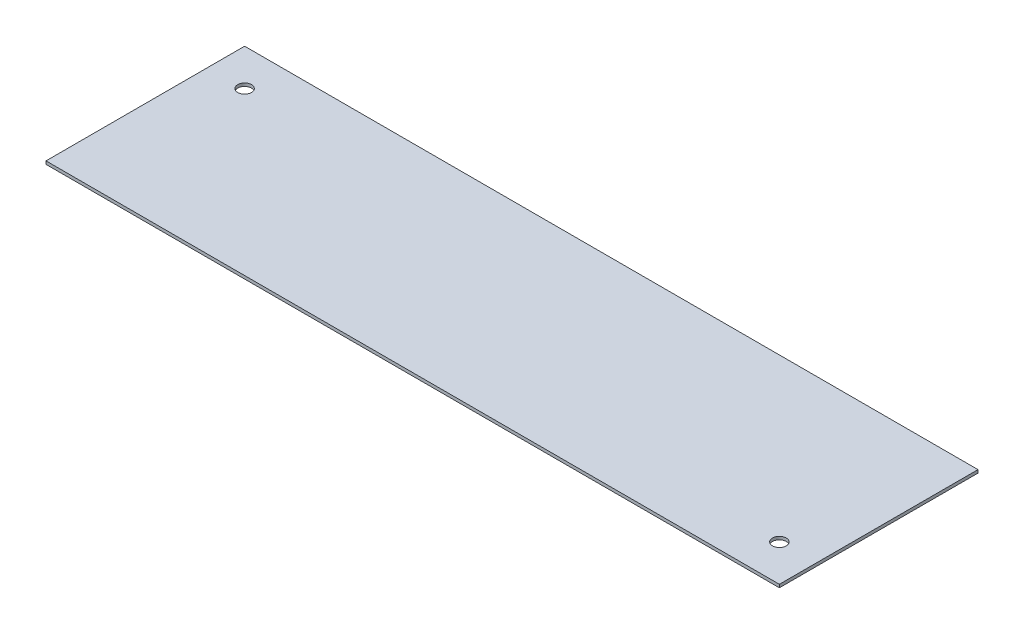
ISO-10303-21;
HEADER;
FILE_DESCRIPTION(('STEP AP214'),'2;1');
FILE_NAME('part.step','',(''),(''),'','','');
FILE_SCHEMA(('AUTOMOTIVE_DESIGN { 1 0 10303 214 1 1 1 1 }'));
ENDSEC;
DATA;
#1=APPLICATION_CONTEXT('core data for automotive mechanical design processes');
#2=APPLICATION_PROTOCOL_DEFINITION('international standard','automotive_design',2000,#1);
#3=PRODUCT_CONTEXT('',#1,'mechanical');
#4=PRODUCT('Part','Part','',(#3));
#5=PRODUCT_RELATED_PRODUCT_CATEGORY('part','',(#4));
#6=PRODUCT_DEFINITION_FORMATION('','',#4);
#7=PRODUCT_DEFINITION_CONTEXT('part definition',#1,'design');
#8=PRODUCT_DEFINITION('design','',#6,#7);
#9=PRODUCT_DEFINITION_SHAPE('','',#8);
#10=(LENGTH_UNIT() NAMED_UNIT(*) SI_UNIT(.MILLI.,.METRE.));
#11=(NAMED_UNIT(*) PLANE_ANGLE_UNIT() SI_UNIT($,.RADIAN.));
#12=(NAMED_UNIT(*) SI_UNIT($,.STERADIAN.) SOLID_ANGLE_UNIT());
#13=UNCERTAINTY_MEASURE_WITH_UNIT(LENGTH_MEASURE(1.E-05),#10,'distance_accuracy_value','');
#14=(GEOMETRIC_REPRESENTATION_CONTEXT(3) GLOBAL_UNCERTAINTY_ASSIGNED_CONTEXT((#13)) GLOBAL_UNIT_ASSIGNED_CONTEXT((#10,
#11,#12)) REPRESENTATION_CONTEXT('',''));
#15=CARTESIAN_POINT('',(0.,0.,0.));
#16=DIRECTION('',(0.,0.,1.));
#17=DIRECTION('',(1.,0.,0.));
#18=AXIS2_PLACEMENT_3D('',#15,#16,#17);
#19=CARTESIAN_POINT('',(-127.622516556291,1.,-32.2086092715232));
#20=DIRECTION('',(1.,0.,0.));
#21=DIRECTION('',(0.,0.,-1.));
#22=AXIS2_PLACEMENT_3D('',#19,#20,#21);
#23=PLANE('',#22);
#24=DIRECTION('',(0.,0.,1.));
#25=VECTOR('',#24,1.);
#26=CARTESIAN_POINT('',(-127.622516556291,0.,-32.2086092715232));
#27=LINE('',#26,#25);
#28=CARTESIAN_POINT('',(-127.622516556291,0.,-32.2086092715232));
#29=VERTEX_POINT('',#28);
#30=CARTESIAN_POINT('',(-127.622516556291,0.,32.7913907284768));
#31=VERTEX_POINT('',#30);
#32=EDGE_CURVE('E95',#29,#31,#27,.T.);
#33=ORIENTED_EDGE('',*,*,#32,.T.);
#34=DIRECTION('',(0.,-1.,0.));
#35=VECTOR('',#34,1.);
#36=CARTESIAN_POINT('',(-127.622516556291,1.,32.7913907284768));
#37=LINE('',#36,#35);
#38=CARTESIAN_POINT('',(-127.622516556291,1.,32.7913907284768));
#39=VERTEX_POINT('',#38);
#40=EDGE_CURVE('E11',#39,#31,#37,.T.);
#41=ORIENTED_EDGE('',*,*,#40,.F.);
#42=DIRECTION('',(0.,0.,1.));
#43=VECTOR('',#42,1.);
#44=CARTESIAN_POINT('',(-127.622516556291,1.,-32.2086092715232));
#45=LINE('',#44,#43);
#46=CARTESIAN_POINT('',(-127.622516556291,1.,-32.2086092715232));
#47=VERTEX_POINT('',#46);
#48=EDGE_CURVE('E83',#47,#39,#45,.T.);
#49=ORIENTED_EDGE('',*,*,#48,.F.);
#50=DIRECTION('',(0.,-1.,0.));
#51=VECTOR('',#50,1.);
#52=CARTESIAN_POINT('',(-127.622516556291,1.,-32.2086092715232));
#53=LINE('',#52,#51);
#54=EDGE_CURVE('E91',#47,#29,#53,.T.);
#55=ORIENTED_EDGE('',*,*,#54,.T.);
#56=EDGE_LOOP('',(#33,#41,#49,#55));
#57=FACE_BOUND('',#56,.T.);
#58=ADVANCED_FACE('F32',(#57),#23,.F.);
#59=CARTESIAN_POINT('',(-127.622516556291,1.,32.7913907284768));
#60=DIRECTION('',(0.,0.,-1.));
#61=DIRECTION('',(-1.,0.,0.));
#62=AXIS2_PLACEMENT_3D('',#59,#60,#61);
#63=PLANE('',#62);
#64=DIRECTION('',(1.,0.,0.));
#65=VECTOR('',#64,1.);
#66=CARTESIAN_POINT('',(-127.622516556291,0.,32.7913907284768));
#67=LINE('',#66,#65);
#68=CARTESIAN_POINT('',(112.377483443709,0.,32.7913907284768));
#69=VERTEX_POINT('',#68);
#70=EDGE_CURVE('E87',#31,#69,#67,.T.);
#71=ORIENTED_EDGE('',*,*,#70,.T.);
#72=DIRECTION('',(0.,-1.,0.));
#73=VECTOR('',#72,1.);
#74=CARTESIAN_POINT('',(112.377483443709,1.,32.7913907284768));
#75=LINE('',#74,#73);
#76=CARTESIAN_POINT('',(112.377483443709,1.,32.7913907284768));
#77=VERTEX_POINT('',#76);
#78=EDGE_CURVE('E40',#77,#69,#75,.T.);
#79=ORIENTED_EDGE('',*,*,#78,.F.);
#80=DIRECTION('',(1.,0.,0.));
#81=VECTOR('',#80,1.);
#82=CARTESIAN_POINT('',(-127.622516556291,1.,32.7913907284768));
#83=LINE('',#82,#81);
#84=EDGE_CURVE('E78',#39,#77,#83,.T.);
#85=ORIENTED_EDGE('',*,*,#84,.F.);
#86=ORIENTED_EDGE('',*,*,#40,.T.);
#87=EDGE_LOOP('',(#71,#79,#85,#86));
#88=FACE_BOUND('',#87,.T.);
#89=ADVANCED_FACE('F86',(#88),#63,.F.);
#90=CARTESIAN_POINT('',(112.377483443709,1.,-32.2086092715232));
#91=DIRECTION('',(-1.,0.,0.));
#92=DIRECTION('',(0.,0.,1.));
#93=AXIS2_PLACEMENT_3D('',#90,#91,#92);
#94=PLANE('',#93);
#95=DIRECTION('',(0.,0.,-1.));
#96=VECTOR('',#95,1.);
#97=CARTESIAN_POINT('',(112.377483443709,0.,-32.2086092715232));
#98=LINE('',#97,#96);
#99=CARTESIAN_POINT('',(112.377483443709,0.,-32.2086092715232));
#100=VERTEX_POINT('',#99);
#101=EDGE_CURVE('E65',#69,#100,#98,.T.);
#102=ORIENTED_EDGE('',*,*,#101,.T.);
#103=DIRECTION('',(0.,-1.,0.));
#104=VECTOR('',#103,1.);
#105=CARTESIAN_POINT('',(112.377483443709,1.,-32.2086092715232));
#106=LINE('',#105,#104);
#107=CARTESIAN_POINT('',(112.377483443709,1.,-32.2086092715232));
#108=VERTEX_POINT('',#107);
#109=EDGE_CURVE('E88',#108,#100,#106,.T.);
#110=ORIENTED_EDGE('',*,*,#109,.F.);
#111=DIRECTION('',(0.,0.,-1.));
#112=VECTOR('',#111,1.);
#113=CARTESIAN_POINT('',(112.377483443709,1.,-32.2086092715232));
#114=LINE('',#113,#112);
#115=EDGE_CURVE('E81',#77,#108,#114,.T.);
#116=ORIENTED_EDGE('',*,*,#115,.F.);
#117=ORIENTED_EDGE('',*,*,#78,.T.);
#118=EDGE_LOOP('',(#102,#110,#116,#117));
#119=FACE_BOUND('',#118,.T.);
#120=ADVANCED_FACE('F89',(#119),#94,.F.);
#121=CARTESIAN_POINT('',(-127.622516556291,1.,-32.2086092715232));
#122=DIRECTION('',(0.,0.,1.));
#123=DIRECTION('',(1.,0.,0.));
#124=AXIS2_PLACEMENT_3D('',#121,#122,#123);
#125=PLANE('',#124);
#126=DIRECTION('',(-1.,0.,0.));
#127=VECTOR('',#126,1.);
#128=CARTESIAN_POINT('',(-127.622516556291,0.,-32.2086092715232));
#129=LINE('',#128,#127);
#130=EDGE_CURVE('E71',#100,#29,#129,.T.);
#131=ORIENTED_EDGE('',*,*,#130,.T.);
#132=ORIENTED_EDGE('',*,*,#54,.F.);
#133=DIRECTION('',(-1.,0.,0.));
#134=VECTOR('',#133,1.);
#135=CARTESIAN_POINT('',(-127.622516556291,1.,-32.2086092715232));
#136=LINE('',#135,#134);
#137=EDGE_CURVE('E48',#108,#47,#136,.T.);
#138=ORIENTED_EDGE('',*,*,#137,.F.);
#139=ORIENTED_EDGE('',*,*,#109,.T.);
#140=EDGE_LOOP('',(#131,#132,#138,#139));
#141=FACE_BOUND('',#140,.T.);
#142=ADVANCED_FACE('F103',(#141),#125,.F.);
#143=CARTESIAN_POINT('',(0.,1.,0.));
#144=DIRECTION('',(0.,1.,0.));
#145=DIRECTION('',(0.,0.,1.));
#146=AXIS2_PLACEMENT_3D('',#143,#144,#145);
#147=PLANE('',#146);
#148=CARTESIAN_POINT('',(100.377483443709,1.,20.7913907284768));
#149=DIRECTION('',(0.,1.,0.));
#150=DIRECTION('',(0.,0.,1.));
#151=AXIS2_PLACEMENT_3D('',#148,#149,#150);
#152=CIRCLE('',#151,2.25);
#153=CARTESIAN_POINT('',(100.377483443709,1.,23.0413907284768));
#154=VERTEX_POINT('',#153);
#155=EDGE_CURVE('E117',#154,#154,#152,.T.);
#156=ORIENTED_EDGE('',*,*,#155,.F.);
#157=EDGE_LOOP('',(#156));
#158=FACE_BOUND('',#157,.T.);
#159=CARTESIAN_POINT('',(-115.622516556291,1.,-20.2086092715232));
#160=DIRECTION('',(0.,1.,0.));
#161=DIRECTION('',(0.,0.,1.));
#162=AXIS2_PLACEMENT_3D('',#159,#160,#161);
#163=CIRCLE('',#162,2.25);
#164=CARTESIAN_POINT('',(-115.622516556291,1.,-17.9586092715232));
#165=VERTEX_POINT('',#164);
#166=EDGE_CURVE('E111',#165,#165,#163,.T.);
#167=ORIENTED_EDGE('',*,*,#166,.F.);
#168=EDGE_LOOP('',(#167));
#169=FACE_BOUND('',#168,.T.);
#170=ORIENTED_EDGE('',*,*,#48,.T.);
#171=ORIENTED_EDGE('',*,*,#84,.T.);
#172=ORIENTED_EDGE('',*,*,#115,.T.);
#173=ORIENTED_EDGE('',*,*,#137,.T.);
#174=EDGE_LOOP('',(#170,#171,#172,#173));
#175=FACE_BOUND('',#174,.T.);
#176=ADVANCED_FACE('F79',(#158,#169,#175),#147,.T.);
#177=CARTESIAN_POINT('',(0.,0.,0.));
#178=DIRECTION('',(0.,1.,0.));
#179=DIRECTION('',(0.,0.,1.));
#180=AXIS2_PLACEMENT_3D('',#177,#178,#179);
#181=PLANE('',#180);
#182=CARTESIAN_POINT('',(100.377483443709,0.,20.7913907284768));
#183=DIRECTION('',(0.,1.,0.));
#184=DIRECTION('',(0.,0.,1.));
#185=AXIS2_PLACEMENT_3D('',#182,#183,#184);
#186=CIRCLE('',#185,2.25);
#187=CARTESIAN_POINT('',(100.377483443709,0.,23.0413907284768));
#188=VERTEX_POINT('',#187);
#189=EDGE_CURVE('E114',#188,#188,#186,.T.);
#190=ORIENTED_EDGE('',*,*,#189,.T.);
#191=EDGE_LOOP('',(#190));
#192=FACE_BOUND('',#191,.T.);
#193=CARTESIAN_POINT('',(-115.622516556291,0.,-20.2086092715232));
#194=DIRECTION('',(0.,1.,0.));
#195=DIRECTION('',(0.,0.,1.));
#196=AXIS2_PLACEMENT_3D('',#193,#194,#195);
#197=CIRCLE('',#196,2.25);
#198=CARTESIAN_POINT('',(-115.622516556291,0.,-17.9586092715232));
#199=VERTEX_POINT('',#198);
#200=EDGE_CURVE('E98',#199,#199,#197,.T.);
#201=ORIENTED_EDGE('',*,*,#200,.T.);
#202=EDGE_LOOP('',(#201));
#203=FACE_BOUND('',#202,.T.);
#204=ORIENTED_EDGE('',*,*,#32,.F.);
#205=ORIENTED_EDGE('',*,*,#130,.F.);
#206=ORIENTED_EDGE('',*,*,#101,.F.);
#207=ORIENTED_EDGE('',*,*,#70,.F.);
#208=EDGE_LOOP('',(#204,#205,#206,#207));
#209=FACE_BOUND('',#208,.T.);
#210=ADVANCED_FACE('F106',(#192,#203,#209),#181,.F.);
#211=CARTESIAN_POINT('',(-115.622516556291,1.,-20.2086092715232));
#212=DIRECTION('',(0.,1.,0.));
#213=DIRECTION('',(0.,0.,1.));
#214=AXIS2_PLACEMENT_3D('',#211,#212,#213);
#215=CYLINDRICAL_SURFACE('',#214,2.25);
#216=ORIENTED_EDGE('',*,*,#200,.F.);
#217=EDGE_LOOP('',(#216));
#218=FACE_BOUND('',#217,.T.);
#219=ORIENTED_EDGE('',*,*,#166,.T.);
#220=EDGE_LOOP('',(#219));
#221=FACE_BOUND('',#220,.T.);
#222=ADVANCED_FACE('F128',(#218,#221),#215,.F.);
#223=CARTESIAN_POINT('',(100.377483443709,1.,20.7913907284768));
#224=DIRECTION('',(0.,1.,0.));
#225=DIRECTION('',(0.,0.,1.));
#226=AXIS2_PLACEMENT_3D('',#223,#224,#225);
#227=CYLINDRICAL_SURFACE('',#226,2.25);
#228=ORIENTED_EDGE('',*,*,#189,.F.);
#229=EDGE_LOOP('',(#228));
#230=FACE_BOUND('',#229,.T.);
#231=ORIENTED_EDGE('',*,*,#155,.T.);
#232=EDGE_LOOP('',(#231));
#233=FACE_BOUND('',#232,.T.);
#234=ADVANCED_FACE('F121',(#230,#233),#227,.F.);
#235=CLOSED_SHELL('',(#58,#89,#120,#142,#176,#210,#222,#234));
#236=MANIFOLD_SOLID_BREP('B2',#235);
#237=ADVANCED_BREP_SHAPE_REPRESENTATION('',(#18,#236),#14);
#238=SHAPE_DEFINITION_REPRESENTATION(#9,#237);
ENDSEC;
END-ISO-10303-21;
